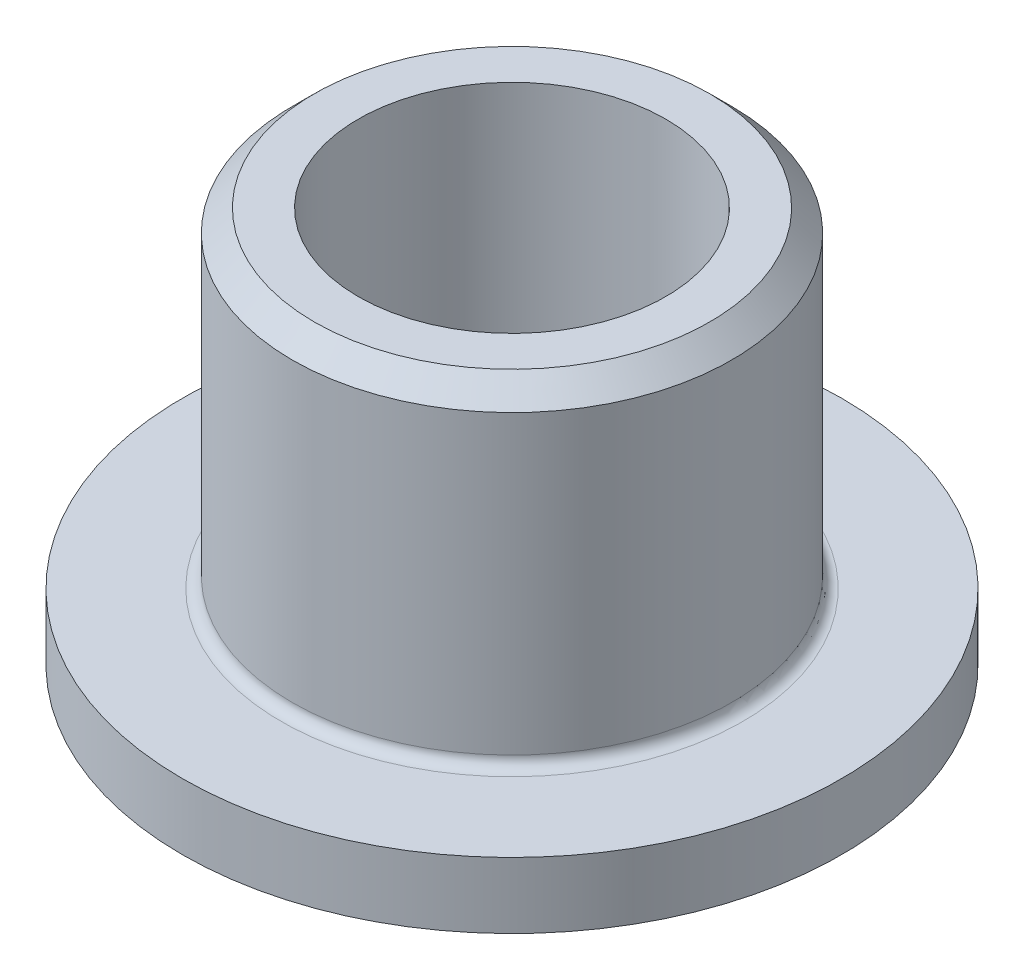
ISO-10303-21;
HEADER;
FILE_DESCRIPTION(('STEP AP214'),'2;1');
FILE_NAME('part.step','',(''),(''),'','','');
FILE_SCHEMA(('AUTOMOTIVE_DESIGN { 1 0 10303 214 1 1 1 1 }'));
ENDSEC;
DATA;
#1=APPLICATION_CONTEXT('core data for automotive mechanical design processes');
#2=APPLICATION_PROTOCOL_DEFINITION('international standard','automotive_design',2000,#1);
#3=PRODUCT_CONTEXT('',#1,'mechanical');
#4=PRODUCT('Part','Part','',(#3));
#5=PRODUCT_RELATED_PRODUCT_CATEGORY('part','',(#4));
#6=PRODUCT_DEFINITION_FORMATION('','',#4);
#7=PRODUCT_DEFINITION_CONTEXT('part definition',#1,'design');
#8=PRODUCT_DEFINITION('design','',#6,#7);
#9=PRODUCT_DEFINITION_SHAPE('','',#8);
#10=(LENGTH_UNIT() NAMED_UNIT(*) SI_UNIT(.MILLI.,.METRE.));
#11=(NAMED_UNIT(*) PLANE_ANGLE_UNIT() SI_UNIT($,.RADIAN.));
#12=(NAMED_UNIT(*) SI_UNIT($,.STERADIAN.) SOLID_ANGLE_UNIT());
#13=UNCERTAINTY_MEASURE_WITH_UNIT(LENGTH_MEASURE(1.E-05),#10,'distance_accuracy_value','');
#14=(GEOMETRIC_REPRESENTATION_CONTEXT(3) GLOBAL_UNCERTAINTY_ASSIGNED_CONTEXT((#13)) GLOBAL_UNIT_ASSIGNED_CONTEXT((#10,
#11,#12)) REPRESENTATION_CONTEXT('',''));
#15=CARTESIAN_POINT('',(0.,0.,0.));
#16=DIRECTION('',(0.,0.,1.));
#17=DIRECTION('',(1.,0.,0.));
#18=AXIS2_PLACEMENT_3D('',#15,#16,#17);
#19=CARTESIAN_POINT('',(0.,7.5,0.));
#20=DIRECTION('',(0.,1.,0.));
#21=DIRECTION('',(0.,0.,1.));
#22=AXIS2_PLACEMENT_3D('',#19,#20,#21);
#23=PLANE('',#22);
#24=CARTESIAN_POINT('',(0.,7.5,0.));
#25=DIRECTION('',(0.,1.,0.));
#26=DIRECTION('',(0.,0.,1.));
#27=AXIS2_PLACEMENT_3D('',#24,#25,#26);
#28=CIRCLE('',#27,4.5);
#29=CARTESIAN_POINT('',(0.,7.5,4.5));
#30=VERTEX_POINT('',#29);
#31=EDGE_CURVE('E59',#30,#30,#28,.T.);
#32=ORIENTED_EDGE('',*,*,#31,.T.);
#33=EDGE_LOOP('',(#32));
#34=FACE_BOUND('',#33,.T.);
#35=CARTESIAN_POINT('',(0.,7.5,0.));
#36=DIRECTION('',(0.,1.,0.));
#37=DIRECTION('',(0.,0.,1.));
#38=AXIS2_PLACEMENT_3D('',#35,#36,#37);
#39=CIRCLE('',#38,3.5);
#40=CARTESIAN_POINT('',(0.,7.5,3.5));
#41=VERTEX_POINT('',#40);
#42=EDGE_CURVE('E65',#41,#41,#39,.T.);
#43=ORIENTED_EDGE('',*,*,#42,.F.);
#44=EDGE_LOOP('',(#43));
#45=FACE_BOUND('',#44,.T.);
#46=ADVANCED_FACE('F41',(#34,#45),#23,.T.);
#47=CARTESIAN_POINT('',(0.,7.5,0.));
#48=DIRECTION('',(0.,-1.,0.));
#49=DIRECTION('',(0.,0.,-1.));
#50=AXIS2_PLACEMENT_3D('',#47,#48,#49);
#51=CYLINDRICAL_SURFACE('',#50,5.);
#52=CARTESIAN_POINT('',(0.,0.25,0.));
#53=DIRECTION('',(0.,-1.,0.));
#54=DIRECTION('',(0.,0.,-1.));
#55=AXIS2_PLACEMENT_3D('',#52,#53,#54);
#56=CIRCLE('',#55,5.);
#57=CARTESIAN_POINT('',(0.,0.25,-5.));
#58=VERTEX_POINT('',#57);
#59=EDGE_CURVE('E49',#58,#58,#56,.F.);
#60=ORIENTED_EDGE('',*,*,#59,.T.);
#61=EDGE_LOOP('',(#60));
#62=FACE_BOUND('',#61,.T.);
#63=CARTESIAN_POINT('',(0.,7.,0.));
#64=DIRECTION('',(0.,1.,0.));
#65=DIRECTION('',(0.,0.,1.));
#66=AXIS2_PLACEMENT_3D('',#63,#64,#65);
#67=CIRCLE('',#66,5.);
#68=CARTESIAN_POINT('',(0.,7.,5.));
#69=VERTEX_POINT('',#68);
#70=EDGE_CURVE('E54',#69,#69,#67,.F.);
#71=ORIENTED_EDGE('',*,*,#70,.T.);
#72=EDGE_LOOP('',(#71));
#73=FACE_BOUND('',#72,.T.);
#74=ADVANCED_FACE('F95',(#62,#73),#51,.T.);
#75=CARTESIAN_POINT('',(0.,7.5,0.));
#76=DIRECTION('',(0.,-1.,0.));
#77=DIRECTION('',(0.,0.,-1.));
#78=AXIS2_PLACEMENT_3D('',#75,#76,#77);
#79=CYLINDRICAL_SURFACE('',#78,3.5);
#80=ORIENTED_EDGE('',*,*,#42,.T.);
#81=EDGE_LOOP('',(#80));
#82=FACE_BOUND('',#81,.T.);
#83=CARTESIAN_POINT('',(0.,-1.5,0.));
#84=DIRECTION('',(0.,-1.,0.));
#85=DIRECTION('',(0.,0.,-1.));
#86=AXIS2_PLACEMENT_3D('',#83,#84,#85);
#87=CIRCLE('',#86,3.5);
#88=CARTESIAN_POINT('',(0.,-1.5,-3.5));
#89=VERTEX_POINT('',#88);
#90=EDGE_CURVE('E74',#89,#89,#87,.T.);
#91=ORIENTED_EDGE('',*,*,#90,.T.);
#92=EDGE_LOOP('',(#91));
#93=FACE_BOUND('',#92,.T.);
#94=ADVANCED_FACE('F82',(#82,#93),#79,.F.);
#95=CARTESIAN_POINT('',(0.,-1.5,0.));
#96=DIRECTION('',(0.,-1.,0.));
#97=DIRECTION('',(0.,0.,-1.));
#98=AXIS2_PLACEMENT_3D('',#95,#96,#97);
#99=PLANE('',#98);
#100=CARTESIAN_POINT('',(0.,-1.5,0.));
#101=DIRECTION('',(0.,-1.,0.));
#102=DIRECTION('',(0.,0.,-1.));
#103=AXIS2_PLACEMENT_3D('',#100,#101,#102);
#104=CIRCLE('',#103,7.5);
#105=CARTESIAN_POINT('',(0.,-1.5,-7.5));
#106=VERTEX_POINT('',#105);
#107=EDGE_CURVE('E69',#106,#106,#104,.T.);
#108=ORIENTED_EDGE('',*,*,#107,.T.);
#109=EDGE_LOOP('',(#108));
#110=FACE_BOUND('',#109,.T.);
#111=ORIENTED_EDGE('',*,*,#90,.F.);
#112=EDGE_LOOP('',(#111));
#113=FACE_BOUND('',#112,.T.);
#114=ADVANCED_FACE('F84',(#110,#113),#99,.T.);
#115=CARTESIAN_POINT('',(0.,0.,0.));
#116=DIRECTION('',(0.,-1.,0.));
#117=DIRECTION('',(0.,0.,-1.));
#118=AXIS2_PLACEMENT_3D('',#115,#116,#117);
#119=PLANE('',#118);
#120=CARTESIAN_POINT('',(0.,0.,0.));
#121=DIRECTION('',(0.,-1.,0.));
#122=DIRECTION('',(0.,0.,-1.));
#123=AXIS2_PLACEMENT_3D('',#120,#121,#122);
#124=CIRCLE('',#123,5.25);
#125=CARTESIAN_POINT('',(0.,0.,-5.25));
#126=VERTEX_POINT('',#125);
#127=EDGE_CURVE('E10',#126,#126,#124,.T.);
#128=ORIENTED_EDGE('',*,*,#127,.T.);
#129=EDGE_LOOP('',(#128));
#130=FACE_BOUND('',#129,.T.);
#131=CARTESIAN_POINT('',(0.,0.,0.));
#132=DIRECTION('',(0.,-1.,0.));
#133=DIRECTION('',(0.,0.,-1.));
#134=AXIS2_PLACEMENT_3D('',#131,#132,#133);
#135=CIRCLE('',#134,7.5);
#136=CARTESIAN_POINT('',(0.,0.,-7.5));
#137=VERTEX_POINT('',#136);
#138=EDGE_CURVE('E70',#137,#137,#135,.T.);
#139=ORIENTED_EDGE('',*,*,#138,.F.);
#140=EDGE_LOOP('',(#139));
#141=FACE_BOUND('',#140,.T.);
#142=ADVANCED_FACE('F86',(#130,#141),#119,.F.);
#143=CARTESIAN_POINT('',(0.,-1.5,0.));
#144=DIRECTION('',(0.,1.,0.));
#145=DIRECTION('',(0.,0.,1.));
#146=AXIS2_PLACEMENT_3D('',#143,#144,#145);
#147=CYLINDRICAL_SURFACE('',#146,7.5);
#148=ORIENTED_EDGE('',*,*,#107,.F.);
#149=EDGE_LOOP('',(#148));
#150=FACE_BOUND('',#149,.T.);
#151=ORIENTED_EDGE('',*,*,#138,.T.);
#152=EDGE_LOOP('',(#151));
#153=FACE_BOUND('',#152,.T.);
#154=ADVANCED_FACE('F93',(#150,#153),#147,.T.);
#155=CARTESIAN_POINT('',(0.,7.5,0.));
#156=DIRECTION('',(0.,-1.,0.));
#157=DIRECTION('',(0.,0.,-1.));
#158=AXIS2_PLACEMENT_3D('',#155,#156,#157);
#159=CONICAL_SURFACE('',#158,4.5,0.785398163397445);
#160=ORIENTED_EDGE('',*,*,#70,.F.);
#161=EDGE_LOOP('',(#160));
#162=FACE_BOUND('',#161,.T.);
#163=ORIENTED_EDGE('',*,*,#31,.F.);
#164=EDGE_LOOP('',(#163));
#165=FACE_BOUND('',#164,.T.);
#166=ADVANCED_FACE('F108',(#162,#165),#159,.T.);
#167=CARTESIAN_POINT('',(0.,0.25,0.));
#168=DIRECTION('',(0.,-1.,0.));
#169=DIRECTION('',(0.,0.,-1.));
#170=AXIS2_PLACEMENT_3D('',#167,#168,#169);
#171=TOROIDAL_SURFACE('',#170,5.25,0.25);
#172=ORIENTED_EDGE('',*,*,#127,.F.);
#173=EDGE_LOOP('',(#172));
#174=FACE_BOUND('',#173,.T.);
#175=ORIENTED_EDGE('',*,*,#59,.F.);
#176=EDGE_LOOP('',(#175));
#177=FACE_BOUND('',#176,.T.);
#178=ADVANCED_FACE('F43',(#174,#177),#171,.F.);
#179=CLOSED_SHELL('',(#46,#74,#94,#114,#142,#154,#166,#178));
#180=MANIFOLD_SOLID_BREP('B2',#179);
#181=ADVANCED_BREP_SHAPE_REPRESENTATION('',(#18,#180),#14);
#182=SHAPE_DEFINITION_REPRESENTATION(#9,#181);
ENDSEC;
END-ISO-10303-21;
